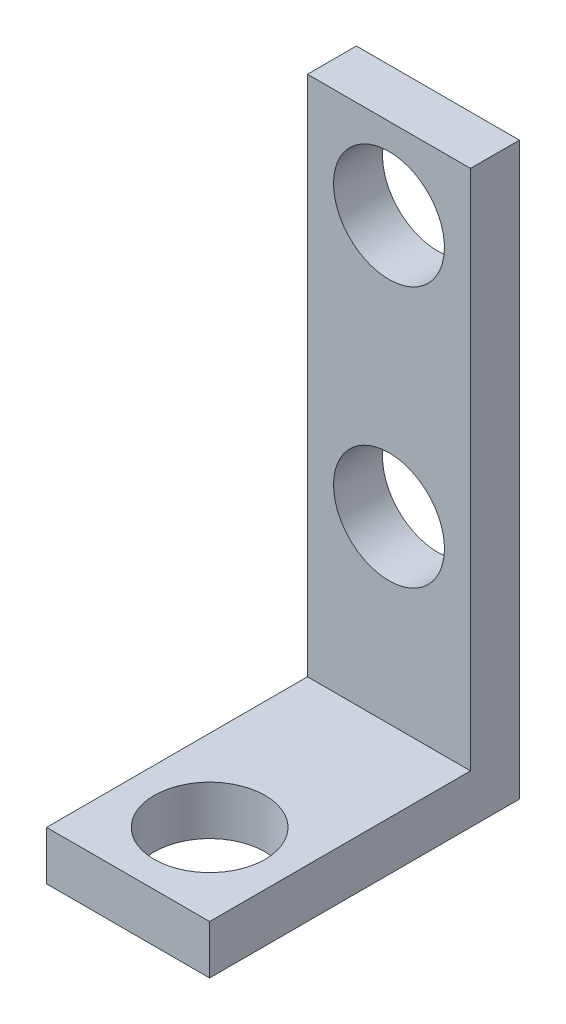
ISO-10303-21;
HEADER;
FILE_DESCRIPTION(('STEP AP214'),'2;1');
FILE_NAME('part.step','',(''),(''),'','','');
FILE_SCHEMA(('AUTOMOTIVE_DESIGN { 1 0 10303 214 1 1 1 1 }'));
ENDSEC;
DATA;
#1=APPLICATION_CONTEXT('core data for automotive mechanical design processes');
#2=APPLICATION_PROTOCOL_DEFINITION('international standard','automotive_design',2000,#1);
#3=PRODUCT_CONTEXT('',#1,'mechanical');
#4=PRODUCT('Part','Part','',(#3));
#5=PRODUCT_RELATED_PRODUCT_CATEGORY('part','',(#4));
#6=PRODUCT_DEFINITION_FORMATION('','',#4);
#7=PRODUCT_DEFINITION_CONTEXT('part definition',#1,'design');
#8=PRODUCT_DEFINITION('design','',#6,#7);
#9=PRODUCT_DEFINITION_SHAPE('','',#8);
#10=(LENGTH_UNIT() NAMED_UNIT(*) SI_UNIT(.MILLI.,.METRE.));
#11=(NAMED_UNIT(*) PLANE_ANGLE_UNIT() SI_UNIT($,.RADIAN.));
#12=(NAMED_UNIT(*) SI_UNIT($,.STERADIAN.) SOLID_ANGLE_UNIT());
#13=UNCERTAINTY_MEASURE_WITH_UNIT(LENGTH_MEASURE(1.E-05),#10,'distance_accuracy_value','');
#14=(GEOMETRIC_REPRESENTATION_CONTEXT(3) GLOBAL_UNCERTAINTY_ASSIGNED_CONTEXT((#13)) GLOBAL_UNIT_ASSIGNED_CONTEXT((#10,
#11,#12)) REPRESENTATION_CONTEXT('',''));
#15=CARTESIAN_POINT('',(0.,0.,0.));
#16=DIRECTION('',(0.,0.,1.));
#17=DIRECTION('',(1.,0.,0.));
#18=AXIS2_PLACEMENT_3D('',#15,#16,#17);
#19=CARTESIAN_POINT('',(5.,8.75,0.));
#20=DIRECTION('',(0.,1.,0.));
#21=DIRECTION('',(0.,0.,1.));
#22=AXIS2_PLACEMENT_3D('',#19,#20,#21);
#23=PLANE('',#22);
#24=DIRECTION('',(0.,0.,-1.));
#25=VECTOR('',#24,1.);
#26=CARTESIAN_POINT('',(0.,8.75,0.));
#27=LINE('',#26,#25);
#28=CARTESIAN_POINT('',(0.,8.75,-3.25));
#29=VERTEX_POINT('',#28);
#30=CARTESIAN_POINT('',(0.,8.75,-4.75));
#31=VERTEX_POINT('',#30);
#32=EDGE_CURVE('E115',#29,#31,#27,.T.);
#33=ORIENTED_EDGE('',*,*,#32,.F.);
#34=DIRECTION('',(-1.,0.,0.));
#35=VECTOR('',#34,1.);
#36=CARTESIAN_POINT('',(5.,8.75,-3.25));
#37=LINE('',#36,#35);
#38=CARTESIAN_POINT('',(5.,8.75,-3.25));
#39=VERTEX_POINT('',#38);
#40=EDGE_CURVE('E11',#39,#29,#37,.T.);
#41=ORIENTED_EDGE('',*,*,#40,.F.);
#42=DIRECTION('',(0.,0.,-1.));
#43=VECTOR('',#42,1.);
#44=CARTESIAN_POINT('',(5.,8.75,0.));
#45=LINE('',#44,#43);
#46=CARTESIAN_POINT('',(5.,8.75,-4.75));
#47=VERTEX_POINT('',#46);
#48=EDGE_CURVE('E129',#39,#47,#45,.T.);
#49=ORIENTED_EDGE('',*,*,#48,.T.);
#50=DIRECTION('',(-1.,0.,0.));
#51=VECTOR('',#50,1.);
#52=CARTESIAN_POINT('',(5.,8.75,-4.75));
#53=LINE('',#52,#51);
#54=EDGE_CURVE('E77',#47,#31,#53,.T.);
#55=ORIENTED_EDGE('',*,*,#54,.T.);
#56=EDGE_LOOP('',(#33,#41,#49,#55));
#57=FACE_BOUND('',#56,.T.);
#58=ADVANCED_FACE('F33',(#57),#23,.T.);
#59=CARTESIAN_POINT('',(5.,0.,-3.25));
#60=DIRECTION('',(0.,0.,-1.));
#61=DIRECTION('',(0.,1.,0.));
#62=AXIS2_PLACEMENT_3D('',#59,#60,#61);
#63=PLANE('',#62);
#64=CARTESIAN_POINT('',(2.5,-1.75,-3.25));
#65=DIRECTION('',(0.,0.,-1.));
#66=DIRECTION('',(0.,1.,0.));
#67=AXIS2_PLACEMENT_3D('',#64,#65,#66);
#68=CIRCLE('',#67,1.7);
#69=CARTESIAN_POINT('',(2.5,-0.049999999999999,-3.25));
#70=VERTEX_POINT('',#69);
#71=EDGE_CURVE('E151',#70,#70,#68,.T.);
#72=ORIENTED_EDGE('',*,*,#71,.T.);
#73=EDGE_LOOP('',(#72));
#74=FACE_BOUND('',#73,.T.);
#75=CARTESIAN_POINT('',(2.5,6.25,-3.25));
#76=DIRECTION('',(0.,0.,-1.));
#77=DIRECTION('',(0.,1.,0.));
#78=AXIS2_PLACEMENT_3D('',#75,#76,#77);
#79=CIRCLE('',#78,1.7);
#80=CARTESIAN_POINT('',(2.5,7.95,-3.25));
#81=VERTEX_POINT('',#80);
#82=EDGE_CURVE('E154',#81,#81,#79,.T.);
#83=ORIENTED_EDGE('',*,*,#82,.T.);
#84=EDGE_LOOP('',(#83));
#85=FACE_BOUND('',#84,.T.);
#86=DIRECTION('',(0.,-1.,0.));
#87=VECTOR('',#86,1.);
#88=CARTESIAN_POINT('',(0.,0.,-3.25));
#89=LINE('',#88,#87);
#90=CARTESIAN_POINT('',(0.,-7.25,-3.25));
#91=VERTEX_POINT('',#90);
#92=EDGE_CURVE('E118',#29,#91,#89,.T.);
#93=ORIENTED_EDGE('',*,*,#92,.T.);
#94=DIRECTION('',(-1.,0.,0.));
#95=VECTOR('',#94,1.);
#96=CARTESIAN_POINT('',(5.,-7.25,-3.25));
#97=LINE('',#96,#95);
#98=CARTESIAN_POINT('',(5.,-7.25,-3.25));
#99=VERTEX_POINT('',#98);
#100=EDGE_CURVE('E41',#99,#91,#97,.T.);
#101=ORIENTED_EDGE('',*,*,#100,.F.);
#102=DIRECTION('',(0.,-1.,0.));
#103=VECTOR('',#102,1.);
#104=CARTESIAN_POINT('',(5.,0.,-3.25));
#105=LINE('',#104,#103);
#106=EDGE_CURVE('E110',#39,#99,#105,.T.);
#107=ORIENTED_EDGE('',*,*,#106,.F.);
#108=ORIENTED_EDGE('',*,*,#40,.T.);
#109=EDGE_LOOP('',(#93,#101,#107,#108));
#110=FACE_BOUND('',#109,.T.);
#111=ADVANCED_FACE('F138',(#74,#85,#110),#63,.F.);
#112=CARTESIAN_POINT('',(5.,-7.25,0.));
#113=DIRECTION('',(0.,1.,0.));
#114=DIRECTION('',(0.,0.,1.));
#115=AXIS2_PLACEMENT_3D('',#112,#113,#114);
#116=PLANE('',#115);
#117=CARTESIAN_POINT('',(2.5,-7.25,2.25));
#118=DIRECTION('',(0.,1.,0.));
#119=DIRECTION('',(0.,0.,1.));
#120=AXIS2_PLACEMENT_3D('',#117,#118,#119);
#121=CIRCLE('',#120,1.7);
#122=CARTESIAN_POINT('',(2.5,-7.25,3.95));
#123=VERTEX_POINT('',#122);
#124=EDGE_CURVE('E119',#123,#123,#121,.T.);
#125=ORIENTED_EDGE('',*,*,#124,.F.);
#126=EDGE_LOOP('',(#125));
#127=FACE_BOUND('',#126,.T.);
#128=DIRECTION('',(0.,0.,-1.));
#129=VECTOR('',#128,1.);
#130=CARTESIAN_POINT('',(0.,-7.25,0.));
#131=LINE('',#130,#129);
#132=CARTESIAN_POINT('',(0.,-7.25,4.75));
#133=VERTEX_POINT('',#132);
#134=EDGE_CURVE('E122',#133,#91,#131,.T.);
#135=ORIENTED_EDGE('',*,*,#134,.F.);
#136=DIRECTION('',(-1.,0.,0.));
#137=VECTOR('',#136,1.);
#138=CARTESIAN_POINT('',(5.,-7.25,4.75));
#139=LINE('',#138,#137);
#140=CARTESIAN_POINT('',(5.,-7.25,4.75));
#141=VERTEX_POINT('',#140);
#142=EDGE_CURVE('E99',#141,#133,#139,.T.);
#143=ORIENTED_EDGE('',*,*,#142,.F.);
#144=DIRECTION('',(0.,0.,-1.));
#145=VECTOR('',#144,1.);
#146=CARTESIAN_POINT('',(5.,-7.25,0.));
#147=LINE('',#146,#145);
#148=EDGE_CURVE('E108',#141,#99,#147,.T.);
#149=ORIENTED_EDGE('',*,*,#148,.T.);
#150=ORIENTED_EDGE('',*,*,#100,.T.);
#151=EDGE_LOOP('',(#135,#143,#149,#150));
#152=FACE_BOUND('',#151,.T.);
#153=ADVANCED_FACE('F135',(#127,#152),#116,.T.);
#154=CARTESIAN_POINT('',(5.,0.,4.75));
#155=DIRECTION('',(0.,0.,1.));
#156=DIRECTION('',(0.,-1.,0.));
#157=AXIS2_PLACEMENT_3D('',#154,#155,#156);
#158=PLANE('',#157);
#159=DIRECTION('',(0.,1.,0.));
#160=VECTOR('',#159,1.);
#161=CARTESIAN_POINT('',(0.,0.,4.75));
#162=LINE('',#161,#160);
#163=CARTESIAN_POINT('',(0.,-8.75,4.75));
#164=VERTEX_POINT('',#163);
#165=EDGE_CURVE('E98',#164,#133,#162,.T.);
#166=ORIENTED_EDGE('',*,*,#165,.F.);
#167=DIRECTION('',(-1.,0.,0.));
#168=VECTOR('',#167,1.);
#169=CARTESIAN_POINT('',(5.,-8.75,4.75));
#170=LINE('',#169,#168);
#171=CARTESIAN_POINT('',(5.,-8.75,4.75));
#172=VERTEX_POINT('',#171);
#173=EDGE_CURVE('E92',#172,#164,#170,.T.);
#174=ORIENTED_EDGE('',*,*,#173,.F.);
#175=DIRECTION('',(0.,1.,0.));
#176=VECTOR('',#175,1.);
#177=CARTESIAN_POINT('',(5.,0.,4.75));
#178=LINE('',#177,#176);
#179=EDGE_CURVE('E96',#172,#141,#178,.T.);
#180=ORIENTED_EDGE('',*,*,#179,.T.);
#181=ORIENTED_EDGE('',*,*,#142,.T.);
#182=EDGE_LOOP('',(#166,#174,#180,#181));
#183=FACE_BOUND('',#182,.T.);
#184=ADVANCED_FACE('F94',(#183),#158,.T.);
#185=CARTESIAN_POINT('',(5.,-8.75,0.));
#186=DIRECTION('',(0.,1.,0.));
#187=DIRECTION('',(0.,0.,1.));
#188=AXIS2_PLACEMENT_3D('',#185,#186,#187);
#189=PLANE('',#188);
#190=CARTESIAN_POINT('',(2.5,-8.75,2.25));
#191=DIRECTION('',(0.,-1.,0.));
#192=DIRECTION('',(0.,0.,-1.));
#193=AXIS2_PLACEMENT_3D('',#190,#191,#192);
#194=CIRCLE('',#193,1.7);
#195=CARTESIAN_POINT('',(2.5,-8.75,0.549999999999999));
#196=VERTEX_POINT('',#195);
#197=EDGE_CURVE('E148',#196,#196,#194,.T.);
#198=ORIENTED_EDGE('',*,*,#197,.F.);
#199=EDGE_LOOP('',(#198));
#200=FACE_BOUND('',#199,.T.);
#201=DIRECTION('',(0.,0.,-1.));
#202=VECTOR('',#201,1.);
#203=CARTESIAN_POINT('',(0.,-8.75,0.));
#204=LINE('',#203,#202);
#205=CARTESIAN_POINT('',(0.,-8.75,-4.75));
#206=VERTEX_POINT('',#205);
#207=EDGE_CURVE('E70',#164,#206,#204,.T.);
#208=ORIENTED_EDGE('',*,*,#207,.T.);
#209=DIRECTION('',(-1.,0.,0.));
#210=VECTOR('',#209,1.);
#211=CARTESIAN_POINT('',(5.,-8.75,-4.75));
#212=LINE('',#211,#210);
#213=CARTESIAN_POINT('',(5.,-8.75,-4.75));
#214=VERTEX_POINT('',#213);
#215=EDGE_CURVE('E100',#214,#206,#212,.T.);
#216=ORIENTED_EDGE('',*,*,#215,.F.);
#217=DIRECTION('',(0.,0.,-1.));
#218=VECTOR('',#217,1.);
#219=CARTESIAN_POINT('',(5.,-8.75,0.));
#220=LINE('',#219,#218);
#221=EDGE_CURVE('E102',#172,#214,#220,.T.);
#222=ORIENTED_EDGE('',*,*,#221,.F.);
#223=ORIENTED_EDGE('',*,*,#173,.T.);
#224=EDGE_LOOP('',(#208,#216,#222,#223));
#225=FACE_BOUND('',#224,.T.);
#226=ADVANCED_FACE('F103',(#200,#225),#189,.F.);
#227=CARTESIAN_POINT('',(5.,0.,-4.75));
#228=DIRECTION('',(0.,0.,1.));
#229=DIRECTION('',(1.,0.,0.));
#230=AXIS2_PLACEMENT_3D('',#227,#228,#229);
#231=PLANE('',#230);
#232=CARTESIAN_POINT('',(2.5,-1.75,-4.75));
#233=DIRECTION('',(0.,0.,-1.));
#234=DIRECTION('',(-1.,0.,0.));
#235=AXIS2_PLACEMENT_3D('',#232,#233,#234);
#236=CIRCLE('',#235,1.7);
#237=CARTESIAN_POINT('',(0.799999999999999,-1.75,-4.75));
#238=VERTEX_POINT('',#237);
#239=EDGE_CURVE('E157',#238,#238,#236,.T.);
#240=ORIENTED_EDGE('',*,*,#239,.F.);
#241=EDGE_LOOP('',(#240));
#242=FACE_BOUND('',#241,.T.);
#243=CARTESIAN_POINT('',(2.5,6.25,-4.75));
#244=DIRECTION('',(0.,0.,-1.));
#245=DIRECTION('',(-1.,0.,0.));
#246=AXIS2_PLACEMENT_3D('',#243,#244,#245);
#247=CIRCLE('',#246,1.7);
#248=CARTESIAN_POINT('',(0.8,6.25,-4.75));
#249=VERTEX_POINT('',#248);
#250=EDGE_CURVE('E158',#249,#249,#247,.T.);
#251=ORIENTED_EDGE('',*,*,#250,.F.);
#252=EDGE_LOOP('',(#251));
#253=FACE_BOUND('',#252,.T.);
#254=DIRECTION('',(0.,1.,0.));
#255=VECTOR('',#254,1.);
#256=CARTESIAN_POINT('',(0.,0.,-4.75));
#257=LINE('',#256,#255);
#258=EDGE_CURVE('E127',#206,#31,#257,.T.);
#259=ORIENTED_EDGE('',*,*,#258,.T.);
#260=ORIENTED_EDGE('',*,*,#54,.F.);
#261=DIRECTION('',(0.,1.,0.));
#262=VECTOR('',#261,1.);
#263=CARTESIAN_POINT('',(5.,0.,-4.75));
#264=LINE('',#263,#262);
#265=EDGE_CURVE('E49',#214,#47,#264,.T.);
#266=ORIENTED_EDGE('',*,*,#265,.F.);
#267=ORIENTED_EDGE('',*,*,#215,.T.);
#268=EDGE_LOOP('',(#259,#260,#266,#267));
#269=FACE_BOUND('',#268,.T.);
#270=ADVANCED_FACE('F143',(#242,#253,#269),#231,.F.);
#271=CARTESIAN_POINT('',(5.,0.,0.));
#272=DIRECTION('',(1.,0.,0.));
#273=DIRECTION('',(0.,0.,-1.));
#274=AXIS2_PLACEMENT_3D('',#271,#272,#273);
#275=PLANE('',#274);
#276=ORIENTED_EDGE('',*,*,#48,.F.);
#277=ORIENTED_EDGE('',*,*,#106,.T.);
#278=ORIENTED_EDGE('',*,*,#148,.F.);
#279=ORIENTED_EDGE('',*,*,#179,.F.);
#280=ORIENTED_EDGE('',*,*,#221,.T.);
#281=ORIENTED_EDGE('',*,*,#265,.T.);
#282=EDGE_LOOP('',(#276,#277,#278,#279,#280,#281));
#283=FACE_BOUND('',#282,.T.);
#284=ADVANCED_FACE('F106',(#283),#275,.T.);
#285=CARTESIAN_POINT('',(0.,0.,0.));
#286=DIRECTION('',(1.,0.,0.));
#287=DIRECTION('',(0.,0.,-1.));
#288=AXIS2_PLACEMENT_3D('',#285,#286,#287);
#289=PLANE('',#288);
#290=ORIENTED_EDGE('',*,*,#32,.T.);
#291=ORIENTED_EDGE('',*,*,#258,.F.);
#292=ORIENTED_EDGE('',*,*,#207,.F.);
#293=ORIENTED_EDGE('',*,*,#165,.T.);
#294=ORIENTED_EDGE('',*,*,#134,.T.);
#295=ORIENTED_EDGE('',*,*,#92,.F.);
#296=EDGE_LOOP('',(#290,#291,#292,#293,#294,#295));
#297=FACE_BOUND('',#296,.T.);
#298=ADVANCED_FACE('F140',(#297),#289,.F.);
#299=CARTESIAN_POINT('',(2.5,8.75,2.25));
#300=DIRECTION('',(0.,-1.,0.));
#301=DIRECTION('',(0.,0.,-1.));
#302=AXIS2_PLACEMENT_3D('',#299,#300,#301);
#303=CYLINDRICAL_SURFACE('',#302,1.7);
#304=ORIENTED_EDGE('',*,*,#124,.T.);
#305=EDGE_LOOP('',(#304));
#306=FACE_BOUND('',#305,.T.);
#307=ORIENTED_EDGE('',*,*,#197,.T.);
#308=EDGE_LOOP('',(#307));
#309=FACE_BOUND('',#308,.T.);
#310=ADVANCED_FACE('F175',(#306,#309),#303,.F.);
#311=CARTESIAN_POINT('',(2.5,6.25,4.75));
#312=DIRECTION('',(0.,0.,-1.));
#313=DIRECTION('',(-1.,0.,0.));
#314=AXIS2_PLACEMENT_3D('',#311,#312,#313);
#315=CYLINDRICAL_SURFACE('',#314,1.7);
#316=ORIENTED_EDGE('',*,*,#250,.T.);
#317=EDGE_LOOP('',(#316));
#318=FACE_BOUND('',#317,.T.);
#319=ORIENTED_EDGE('',*,*,#82,.F.);
#320=EDGE_LOOP('',(#319));
#321=FACE_BOUND('',#320,.T.);
#322=ADVANCED_FACE('F172',(#318,#321),#315,.F.);
#323=CARTESIAN_POINT('',(2.5,-1.75,4.75));
#324=DIRECTION('',(0.,0.,-1.));
#325=DIRECTION('',(-1.,0.,0.));
#326=AXIS2_PLACEMENT_3D('',#323,#324,#325);
#327=CYLINDRICAL_SURFACE('',#326,1.7);
#328=ORIENTED_EDGE('',*,*,#239,.T.);
#329=EDGE_LOOP('',(#328));
#330=FACE_BOUND('',#329,.T.);
#331=ORIENTED_EDGE('',*,*,#71,.F.);
#332=EDGE_LOOP('',(#331));
#333=FACE_BOUND('',#332,.T.);
#334=ADVANCED_FACE('F164',(#330,#333),#327,.F.);
#335=CLOSED_SHELL('',(#58,#111,#153,#184,#226,#270,#284,#298,#310,#322,#334));
#336=MANIFOLD_SOLID_BREP('B2',#335);
#337=ADVANCED_BREP_SHAPE_REPRESENTATION('',(#18,#336),#14);
#338=SHAPE_DEFINITION_REPRESENTATION(#9,#337);
ENDSEC;
END-ISO-10303-21;
